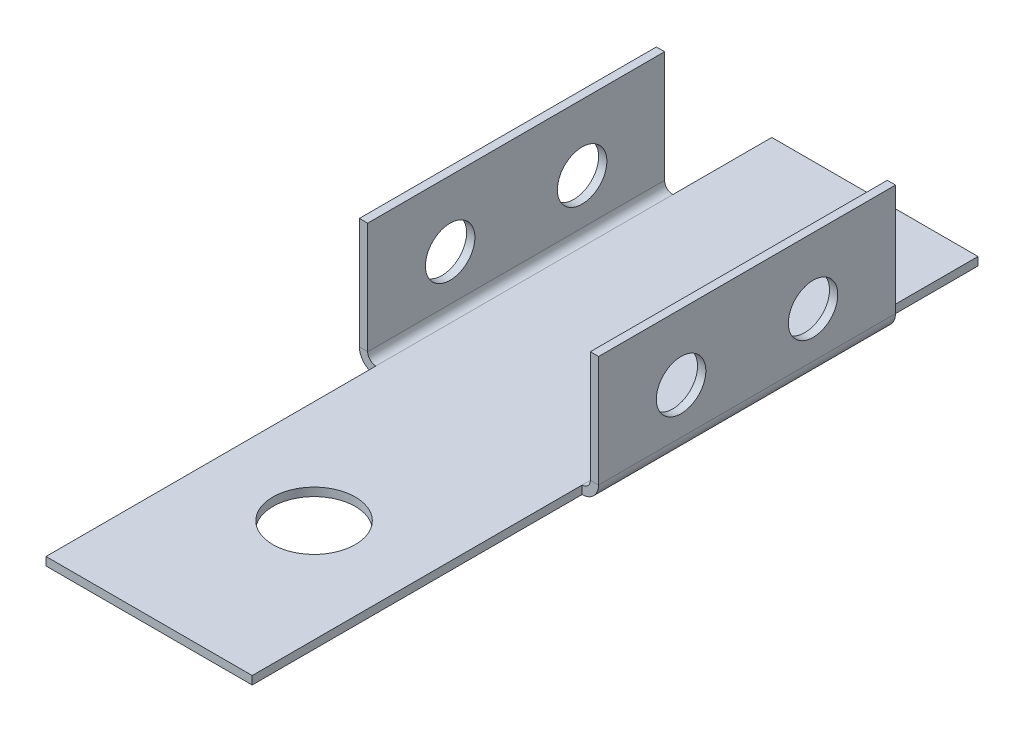
ISO-10303-21;
HEADER;
FILE_DESCRIPTION(('STEP AP214'),'2;1');
FILE_NAME('part.step','',(''),(''),'','','');
FILE_SCHEMA(('AUTOMOTIVE_DESIGN { 1 0 10303 214 1 1 1 1 }'));
ENDSEC;
DATA;
#1=APPLICATION_CONTEXT('core data for automotive mechanical design processes');
#2=APPLICATION_PROTOCOL_DEFINITION('international standard','automotive_design',2000,#1);
#3=PRODUCT_CONTEXT('',#1,'mechanical');
#4=PRODUCT('Part','Part','',(#3));
#5=PRODUCT_RELATED_PRODUCT_CATEGORY('part','',(#4));
#6=PRODUCT_DEFINITION_FORMATION('','',#4);
#7=PRODUCT_DEFINITION_CONTEXT('part definition',#1,'design');
#8=PRODUCT_DEFINITION('design','',#6,#7);
#9=PRODUCT_DEFINITION_SHAPE('','',#8);
#10=(LENGTH_UNIT() NAMED_UNIT(*) SI_UNIT(.MILLI.,.METRE.));
#11=(NAMED_UNIT(*) PLANE_ANGLE_UNIT() SI_UNIT($,.RADIAN.));
#12=(NAMED_UNIT(*) SI_UNIT($,.STERADIAN.) SOLID_ANGLE_UNIT());
#13=UNCERTAINTY_MEASURE_WITH_UNIT(LENGTH_MEASURE(1.E-05),#10,'distance_accuracy_value','');
#14=(GEOMETRIC_REPRESENTATION_CONTEXT(3) GLOBAL_UNCERTAINTY_ASSIGNED_CONTEXT((#13)) GLOBAL_UNIT_ASSIGNED_CONTEXT((#10,
#11,#12)) REPRESENTATION_CONTEXT('',''));
#15=CARTESIAN_POINT('',(0.,0.,0.));
#16=DIRECTION('',(0.,0.,1.));
#17=DIRECTION('',(1.,0.,0.));
#18=AXIS2_PLACEMENT_3D('',#15,#16,#17);
#19=CARTESIAN_POINT('',(-24.0068697123519,-13.5559898477157,48.));
#20=DIRECTION('',(-1.,0.,0.));
#21=DIRECTION('',(0.,0.,1.));
#22=AXIS2_PLACEMENT_3D('',#19,#20,#21);
#23=PLANE('',#22);
#24=CARTESIAN_POINT('',(-24.0068697123519,-9.80598984771573,23.));
#25=DIRECTION('',(-1.,0.,0.));
#26=DIRECTION('',(0.,0.,1.));
#27=AXIS2_PLACEMENT_3D('',#24,#25,#26);
#28=CIRCLE('',#27,1.5);
#29=CARTESIAN_POINT('',(-24.0068697123519,-9.80598984771573,24.5));
#30=VERTEX_POINT('',#29);
#31=EDGE_CURVE('E239',#30,#30,#28,.T.);
#32=ORIENTED_EDGE('',*,*,#31,.T.);
#33=EDGE_LOOP('',(#32));
#34=FACE_BOUND('',#33,.T.);
#35=CARTESIAN_POINT('',(-24.0068697123519,-9.80598984771573,15.));
#36=DIRECTION('',(-1.,0.,0.));
#37=DIRECTION('',(0.,0.,1.));
#38=AXIS2_PLACEMENT_3D('',#35,#36,#37);
#39=CIRCLE('',#38,1.5);
#40=CARTESIAN_POINT('',(-24.0068697123519,-9.80598984771573,16.5));
#41=VERTEX_POINT('',#40);
#42=EDGE_CURVE('E233',#41,#41,#39,.T.);
#43=ORIENTED_EDGE('',*,*,#42,.T.);
#44=EDGE_LOOP('',(#43));
#45=FACE_BOUND('',#44,.T.);
#46=DIRECTION('',(0.,1.,0.));
#47=VECTOR('',#46,1.);
#48=CARTESIAN_POINT('',(-24.0068697123519,-13.5559898477157,28.));
#49=LINE('',#48,#47);
#50=CARTESIAN_POINT('',(-24.0068697123519,-5.80598984771573,28.));
#51=VERTEX_POINT('',#50);
#52=CARTESIAN_POINT('',(-24.0068697123519,-12.5559898477157,28.));
#53=VERTEX_POINT('',#52);
#54=EDGE_CURVE('E443',#51,#53,#49,.F.);
#55=ORIENTED_EDGE('',*,*,#54,.T.);
#56=DIRECTION('',(0.,0.,-1.));
#57=VECTOR('',#56,1.);
#58=CARTESIAN_POINT('',(-24.0068697123519,-12.5559898477157,48.));
#59=LINE('',#58,#57);
#60=CARTESIAN_POINT('',(-24.0068697123519,-12.5559898477157,10.));
#61=VERTEX_POINT('',#60);
#62=EDGE_CURVE('E68',#53,#61,#59,.T.);
#63=ORIENTED_EDGE('',*,*,#62,.T.);
#64=DIRECTION('',(0.,1.,0.));
#65=VECTOR('',#64,1.);
#66=CARTESIAN_POINT('',(-24.0068697123519,-13.5559898477157,10.));
#67=LINE('',#66,#65);
#68=CARTESIAN_POINT('',(-24.0068697123519,-5.80598984771573,10.));
#69=VERTEX_POINT('',#68);
#70=EDGE_CURVE('E388',#61,#69,#67,.T.);
#71=ORIENTED_EDGE('',*,*,#70,.T.);
#72=DIRECTION('',(0.,0.,-1.));
#73=VECTOR('',#72,1.);
#74=CARTESIAN_POINT('',(-24.0068697123519,-5.80598984771573,48.));
#75=LINE('',#74,#73);
#76=EDGE_CURVE('E285',#51,#69,#75,.T.);
#77=ORIENTED_EDGE('',*,*,#76,.F.);
#78=EDGE_LOOP('',(#55,#63,#71,#77));
#79=FACE_BOUND('',#78,.T.);
#80=ADVANCED_FACE('F46',(#34,#45,#79),#23,.F.);
#81=CARTESIAN_POINT('',(-24.5068697123519,-13.5559898477157,48.));
#82=DIRECTION('',(-1.,0.,0.));
#83=DIRECTION('',(0.,0.,1.));
#84=AXIS2_PLACEMENT_3D('',#81,#82,#83);
#85=PLANE('',#84);
#86=CARTESIAN_POINT('',(-24.5068697123519,-9.80598984771573,23.));
#87=DIRECTION('',(-1.,0.,0.));
#88=DIRECTION('',(0.,0.,1.));
#89=AXIS2_PLACEMENT_3D('',#86,#87,#88);
#90=CIRCLE('',#89,1.5);
#91=CARTESIAN_POINT('',(-24.5068697123519,-9.80598984771573,24.5));
#92=VERTEX_POINT('',#91);
#93=EDGE_CURVE('E236',#92,#92,#90,.T.);
#94=ORIENTED_EDGE('',*,*,#93,.F.);
#95=EDGE_LOOP('',(#94));
#96=FACE_BOUND('',#95,.T.);
#97=CARTESIAN_POINT('',(-24.5068697123519,-9.80598984771573,15.));
#98=DIRECTION('',(-1.,0.,0.));
#99=DIRECTION('',(0.,0.,1.));
#100=AXIS2_PLACEMENT_3D('',#97,#98,#99);
#101=CIRCLE('',#100,1.5);
#102=CARTESIAN_POINT('',(-24.5068697123519,-9.80598984771573,16.5));
#103=VERTEX_POINT('',#102);
#104=EDGE_CURVE('E230',#103,#103,#101,.T.);
#105=ORIENTED_EDGE('',*,*,#104,.F.);
#106=EDGE_LOOP('',(#105));
#107=FACE_BOUND('',#106,.T.);
#108=DIRECTION('',(0.,0.,-1.));
#109=VECTOR('',#108,1.);
#110=CARTESIAN_POINT('',(-24.5068697123519,-12.5559898477157,48.));
#111=LINE('',#110,#109);
#112=CARTESIAN_POINT('',(-24.5068697123519,-12.5559898477157,28.));
#113=VERTEX_POINT('',#112);
#114=CARTESIAN_POINT('',(-24.5068697123519,-12.5559898477157,10.));
#115=VERTEX_POINT('',#114);
#116=EDGE_CURVE('E281',#113,#115,#111,.T.);
#117=ORIENTED_EDGE('',*,*,#116,.F.);
#118=DIRECTION('',(0.,-1.,0.));
#119=VECTOR('',#118,1.);
#120=CARTESIAN_POINT('',(-24.5068697123519,-13.5559898477157,28.));
#121=LINE('',#120,#119);
#122=CARTESIAN_POINT('',(-24.5068697123519,-5.80598984771573,28.));
#123=VERTEX_POINT('',#122);
#124=EDGE_CURVE('E435',#123,#113,#121,.T.);
#125=ORIENTED_EDGE('',*,*,#124,.F.);
#126=DIRECTION('',(0.,0.,-1.));
#127=VECTOR('',#126,1.);
#128=CARTESIAN_POINT('',(-24.5068697123519,-5.80598984771573,48.));
#129=LINE('',#128,#127);
#130=CARTESIAN_POINT('',(-24.5068697123519,-5.80598984771573,10.));
#131=VERTEX_POINT('',#130);
#132=EDGE_CURVE('E283',#123,#131,#129,.T.);
#133=ORIENTED_EDGE('',*,*,#132,.T.);
#134=DIRECTION('',(0.,1.,0.));
#135=VECTOR('',#134,1.);
#136=CARTESIAN_POINT('',(-24.5068697123519,-13.5559898477157,10.));
#137=LINE('',#136,#135);
#138=EDGE_CURVE('E387',#115,#131,#137,.T.);
#139=ORIENTED_EDGE('',*,*,#138,.F.);
#140=EDGE_LOOP('',(#117,#125,#133,#139));
#141=FACE_BOUND('',#140,.T.);
#142=ADVANCED_FACE('F312',(#96,#107,#141),#85,.T.);
#143=CARTESIAN_POINT('',(-24.5068697123519,-5.80598984771573,48.));
#144=DIRECTION('',(0.,1.,0.));
#145=DIRECTION('',(0.,0.,1.));
#146=AXIS2_PLACEMENT_3D('',#143,#144,#145);
#147=PLANE('',#146);
#148=ORIENTED_EDGE('',*,*,#132,.F.);
#149=DIRECTION('',(-1.,0.,0.));
#150=VECTOR('',#149,1.);
#151=CARTESIAN_POINT('',(-24.5068697123519,-5.80598984771573,28.));
#152=LINE('',#151,#150);
#153=EDGE_CURVE('E381',#123,#51,#152,.F.);
#154=ORIENTED_EDGE('',*,*,#153,.T.);
#155=ORIENTED_EDGE('',*,*,#76,.T.);
#156=DIRECTION('',(-1.,0.,0.));
#157=VECTOR('',#156,1.);
#158=CARTESIAN_POINT('',(-24.5068697123519,-5.80598984771573,10.));
#159=LINE('',#158,#157);
#160=EDGE_CURVE('E187',#131,#69,#159,.F.);
#161=ORIENTED_EDGE('',*,*,#160,.F.);
#162=EDGE_LOOP('',(#148,#154,#155,#161));
#163=FACE_BOUND('',#162,.T.);
#164=ADVANCED_FACE('F317',(#163),#147,.T.);
#165=CARTESIAN_POINT('',(-25.0068697123519,-12.5559898477157,48.));
#166=DIRECTION('',(0.,0.,-1.));
#167=DIRECTION('',(-1.,0.,0.));
#168=AXIS2_PLACEMENT_3D('',#165,#166,#167);
#169=CYLINDRICAL_SURFACE('',#168,0.5);
#170=DIRECTION('',(0.,0.,-1.));
#171=VECTOR('',#170,1.);
#172=CARTESIAN_POINT('',(-25.0068697123519,-13.0559898477157,48.));
#173=LINE('',#172,#171);
#174=CARTESIAN_POINT('',(-25.0068697123519,-13.0559898477157,28.));
#175=VERTEX_POINT('',#174);
#176=CARTESIAN_POINT('',(-25.0068697123519,-13.0559898477157,10.));
#177=VERTEX_POINT('',#176);
#178=EDGE_CURVE('E277',#175,#177,#173,.T.);
#179=ORIENTED_EDGE('',*,*,#178,.F.);
#180=CARTESIAN_POINT('',(-25.0068697123519,-12.5559898477157,28.));
#181=DIRECTION('',(0.,0.,-1.));
#182=DIRECTION('',(-1.,0.,0.));
#183=AXIS2_PLACEMENT_3D('',#180,#181,#182);
#184=CIRCLE('',#183,0.5);
#185=EDGE_CURVE('E363',#113,#175,#184,.T.);
#186=ORIENTED_EDGE('',*,*,#185,.F.);
#187=ORIENTED_EDGE('',*,*,#116,.T.);
#188=CARTESIAN_POINT('',(-25.0068697123519,-12.5559898477157,10.));
#189=DIRECTION('',(0.,0.,1.));
#190=DIRECTION('',(0.,-1.,0.));
#191=AXIS2_PLACEMENT_3D('',#188,#189,#190);
#192=CIRCLE('',#191,0.5);
#193=EDGE_CURVE('E374',#177,#115,#192,.T.);
#194=ORIENTED_EDGE('',*,*,#193,.F.);
#195=EDGE_LOOP('',(#179,#186,#187,#194));
#196=FACE_BOUND('',#195,.T.);
#197=ADVANCED_FACE('F323',(#196),#169,.F.);
#198=CARTESIAN_POINT('',(-25.0068697123519,-12.5559898477157,48.));
#199=DIRECTION('',(0.,0.,-1.));
#200=DIRECTION('',(-1.,0.,0.));
#201=AXIS2_PLACEMENT_3D('',#198,#199,#200);
#202=CYLINDRICAL_SURFACE('',#201,1.);
#203=CARTESIAN_POINT('',(-25.0068697123519,-12.5559898477157,28.));
#204=DIRECTION('',(0.,0.,-1.));
#205=DIRECTION('',(0.,1.,0.));
#206=AXIS2_PLACEMENT_3D('',#203,#204,#205);
#207=CIRCLE('',#206,1.);
#208=CARTESIAN_POINT('',(-25.0068697123519,-13.5559898477157,28.));
#209=VERTEX_POINT('',#208);
#210=EDGE_CURVE('E356',#53,#209,#207,.T.);
#211=ORIENTED_EDGE('',*,*,#210,.T.);
#212=DIRECTION('',(0.,0.,-1.));
#213=VECTOR('',#212,1.);
#214=CARTESIAN_POINT('',(-25.0068697123519,-13.5559898477157,48.));
#215=LINE('',#214,#213);
#216=CARTESIAN_POINT('',(-25.0068697123519,-13.5559898477157,10.));
#217=VERTEX_POINT('',#216);
#218=EDGE_CURVE('E255',#209,#217,#215,.T.);
#219=ORIENTED_EDGE('',*,*,#218,.T.);
#220=CARTESIAN_POINT('',(-25.0068697123519,-12.5559898477157,10.));
#221=DIRECTION('',(0.,0.,-1.));
#222=DIRECTION('',(-1.,0.,0.));
#223=AXIS2_PLACEMENT_3D('',#220,#221,#222);
#224=CIRCLE('',#223,1.);
#225=EDGE_CURVE('E373',#217,#61,#224,.F.);
#226=ORIENTED_EDGE('',*,*,#225,.T.);
#227=ORIENTED_EDGE('',*,*,#62,.F.);
#228=EDGE_LOOP('',(#211,#219,#226,#227));
#229=FACE_BOUND('',#228,.T.);
#230=ADVANCED_FACE('F328',(#229),#202,.T.);
#231=CARTESIAN_POINT('',(-38.0068697123519,-5.80598984771574,48.));
#232=DIRECTION('',(1.,0.,0.));
#233=DIRECTION('',(0.,1.,0.));
#234=AXIS2_PLACEMENT_3D('',#231,#232,#233);
#235=PLANE('',#234);
#236=CARTESIAN_POINT('',(-38.0068697123519,-9.80598984771573,23.));
#237=DIRECTION('',(1.,0.,0.));
#238=DIRECTION('',(0.,1.,0.));
#239=AXIS2_PLACEMENT_3D('',#236,#237,#238);
#240=CIRCLE('',#239,1.5);
#241=CARTESIAN_POINT('',(-38.0068697123519,-8.30598984771573,23.));
#242=VERTEX_POINT('',#241);
#243=EDGE_CURVE('E224',#242,#242,#240,.T.);
#244=ORIENTED_EDGE('',*,*,#243,.F.);
#245=EDGE_LOOP('',(#244));
#246=FACE_BOUND('',#245,.T.);
#247=CARTESIAN_POINT('',(-38.0068697123519,-9.80598984771573,15.));
#248=DIRECTION('',(1.,0.,0.));
#249=DIRECTION('',(0.,1.,0.));
#250=AXIS2_PLACEMENT_3D('',#247,#248,#249);
#251=CIRCLE('',#250,1.5);
#252=CARTESIAN_POINT('',(-38.0068697123519,-8.30598984771573,15.));
#253=VERTEX_POINT('',#252);
#254=EDGE_CURVE('E218',#253,#253,#251,.T.);
#255=ORIENTED_EDGE('',*,*,#254,.F.);
#256=EDGE_LOOP('',(#255));
#257=FACE_BOUND('',#256,.T.);
#258=DIRECTION('',(0.,0.,-1.));
#259=VECTOR('',#258,1.);
#260=CARTESIAN_POINT('',(-38.0068697123519,-12.5559898477157,48.));
#261=LINE('',#260,#259);
#262=CARTESIAN_POINT('',(-38.0068697123519,-12.5559898477157,28.));
#263=VERTEX_POINT('',#262);
#264=CARTESIAN_POINT('',(-38.0068697123519,-12.5559898477157,10.));
#265=VERTEX_POINT('',#264);
#266=EDGE_CURVE('E271',#263,#265,#261,.T.);
#267=ORIENTED_EDGE('',*,*,#266,.T.);
#268=DIRECTION('',(0.,-1.,0.));
#269=VECTOR('',#268,1.);
#270=CARTESIAN_POINT('',(-38.0068697123519,-5.80598984771575,10.));
#271=LINE('',#270,#269);
#272=CARTESIAN_POINT('',(-38.0068697123519,-5.80598984771573,10.));
#273=VERTEX_POINT('',#272);
#274=EDGE_CURVE('E191',#273,#265,#271,.T.);
#275=ORIENTED_EDGE('',*,*,#274,.F.);
#276=DIRECTION('',(0.,0.,-1.));
#277=VECTOR('',#276,1.);
#278=CARTESIAN_POINT('',(-38.0068697123519,-5.80598984771574,48.));
#279=LINE('',#278,#277);
#280=CARTESIAN_POINT('',(-38.0068697123519,-5.80598984771573,28.));
#281=VERTEX_POINT('',#280);
#282=EDGE_CURVE('E268',#281,#273,#279,.T.);
#283=ORIENTED_EDGE('',*,*,#282,.F.);
#284=DIRECTION('',(0.,1.,0.));
#285=VECTOR('',#284,1.);
#286=CARTESIAN_POINT('',(-38.0068697123519,-5.80598984771574,28.));
#287=LINE('',#286,#285);
#288=EDGE_CURVE('E210',#263,#281,#287,.T.);
#289=ORIENTED_EDGE('',*,*,#288,.F.);
#290=EDGE_LOOP('',(#267,#275,#283,#289));
#291=FACE_BOUND('',#290,.T.);
#292=ADVANCED_FACE('F338',(#246,#257,#291),#235,.T.);
#293=CARTESIAN_POINT('',(-38.5068697123519,-5.80598984771574,48.));
#294=DIRECTION('',(1.,0.,0.));
#295=DIRECTION('',(0.,1.,0.));
#296=AXIS2_PLACEMENT_3D('',#293,#294,#295);
#297=PLANE('',#296);
#298=CARTESIAN_POINT('',(-38.5068697123519,-9.80598984771573,23.));
#299=DIRECTION('',(1.,0.,0.));
#300=DIRECTION('',(0.,1.,0.));
#301=AXIS2_PLACEMENT_3D('',#298,#299,#300);
#302=CIRCLE('',#301,1.5);
#303=CARTESIAN_POINT('',(-38.5068697123519,-8.30598984771573,23.));
#304=VERTEX_POINT('',#303);
#305=EDGE_CURVE('E227',#304,#304,#302,.T.);
#306=ORIENTED_EDGE('',*,*,#305,.T.);
#307=EDGE_LOOP('',(#306));
#308=FACE_BOUND('',#307,.T.);
#309=CARTESIAN_POINT('',(-38.5068697123519,-9.80598984771573,15.));
#310=DIRECTION('',(1.,0.,0.));
#311=DIRECTION('',(0.,1.,0.));
#312=AXIS2_PLACEMENT_3D('',#309,#310,#311);
#313=CIRCLE('',#312,1.5);
#314=CARTESIAN_POINT('',(-38.5068697123519,-8.30598984771573,15.));
#315=VERTEX_POINT('',#314);
#316=EDGE_CURVE('E221',#315,#315,#313,.T.);
#317=ORIENTED_EDGE('',*,*,#316,.T.);
#318=EDGE_LOOP('',(#317));
#319=FACE_BOUND('',#318,.T.);
#320=DIRECTION('',(0.,1.,0.));
#321=VECTOR('',#320,1.);
#322=CARTESIAN_POINT('',(-38.5068697123519,-5.80598984771574,10.));
#323=LINE('',#322,#321);
#324=CARTESIAN_POINT('',(-38.5068697123519,-5.80598984771573,10.));
#325=VERTEX_POINT('',#324);
#326=CARTESIAN_POINT('',(-38.5068697123519,-12.5559898477157,10.));
#327=VERTEX_POINT('',#326);
#328=EDGE_CURVE('E192',#325,#327,#323,.F.);
#329=ORIENTED_EDGE('',*,*,#328,.T.);
#330=DIRECTION('',(0.,0.,-1.));
#331=VECTOR('',#330,1.);
#332=CARTESIAN_POINT('',(-38.5068697123519,-12.5559898477157,48.));
#333=LINE('',#332,#331);
#334=CARTESIAN_POINT('',(-38.5068697123519,-12.5559898477157,28.));
#335=VERTEX_POINT('',#334);
#336=EDGE_CURVE('E262',#335,#327,#333,.T.);
#337=ORIENTED_EDGE('',*,*,#336,.F.);
#338=DIRECTION('',(0.,1.,0.));
#339=VECTOR('',#338,1.);
#340=CARTESIAN_POINT('',(-38.5068697123519,-5.80598984771573,28.));
#341=LINE('',#340,#339);
#342=CARTESIAN_POINT('',(-38.5068697123519,-5.80598984771573,28.));
#343=VERTEX_POINT('',#342);
#344=EDGE_CURVE('E209',#335,#343,#341,.T.);
#345=ORIENTED_EDGE('',*,*,#344,.T.);
#346=DIRECTION('',(0.,0.,-1.));
#347=VECTOR('',#346,1.);
#348=CARTESIAN_POINT('',(-38.5068697123519,-5.80598984771574,48.));
#349=LINE('',#348,#347);
#350=EDGE_CURVE('E265',#343,#325,#349,.T.);
#351=ORIENTED_EDGE('',*,*,#350,.T.);
#352=EDGE_LOOP('',(#329,#337,#345,#351));
#353=FACE_BOUND('',#352,.T.);
#354=ADVANCED_FACE('F336',(#308,#319,#353),#297,.F.);
#355=CARTESIAN_POINT('',(-37.5068697123519,-12.5559898477157,48.));
#356=DIRECTION('',(0.,0.,-1.));
#357=DIRECTION('',(-1.,0.,0.));
#358=AXIS2_PLACEMENT_3D('',#355,#356,#357);
#359=CYLINDRICAL_SURFACE('',#358,0.5);
#360=DIRECTION('',(0.,0.,-1.));
#361=VECTOR('',#360,1.);
#362=CARTESIAN_POINT('',(-37.5068697123519,-13.0559898477157,48.));
#363=LINE('',#362,#361);
#364=CARTESIAN_POINT('',(-37.5068697123519,-13.0559898477157,28.));
#365=VERTEX_POINT('',#364);
#366=CARTESIAN_POINT('',(-37.5068697123519,-13.0559898477157,10.));
#367=VERTEX_POINT('',#366);
#368=EDGE_CURVE('E274',#365,#367,#363,.T.);
#369=ORIENTED_EDGE('',*,*,#368,.T.);
#370=CARTESIAN_POINT('',(-37.5068697123519,-12.5559898477157,10.));
#371=DIRECTION('',(0.,0.,1.));
#372=DIRECTION('',(0.,-1.,0.));
#373=AXIS2_PLACEMENT_3D('',#370,#371,#372);
#374=CIRCLE('',#373,0.5);
#375=EDGE_CURVE('E182',#265,#367,#374,.T.);
#376=ORIENTED_EDGE('',*,*,#375,.F.);
#377=ORIENTED_EDGE('',*,*,#266,.F.);
#378=CARTESIAN_POINT('',(-37.5068697123519,-12.5559898477157,28.));
#379=DIRECTION('',(0.,0.,-1.));
#380=DIRECTION('',(0.,1.,0.));
#381=AXIS2_PLACEMENT_3D('',#378,#379,#380);
#382=CIRCLE('',#381,0.5);
#383=EDGE_CURVE('E200',#365,#263,#382,.T.);
#384=ORIENTED_EDGE('',*,*,#383,.F.);
#385=EDGE_LOOP('',(#369,#376,#377,#384));
#386=FACE_BOUND('',#385,.T.);
#387=ADVANCED_FACE('F332',(#386),#359,.F.);
#388=CARTESIAN_POINT('',(-38.5068697123519,-5.80598984771574,48.));
#389=DIRECTION('',(0.,1.,0.));
#390=DIRECTION('',(-1.,0.,0.));
#391=AXIS2_PLACEMENT_3D('',#388,#389,#390);
#392=PLANE('',#391);
#393=ORIENTED_EDGE('',*,*,#282,.T.);
#394=DIRECTION('',(1.,0.,0.));
#395=VECTOR('',#394,1.);
#396=CARTESIAN_POINT('',(-38.0068697123519,-5.80598984771573,10.));
#397=LINE('',#396,#395);
#398=EDGE_CURVE('E195',#273,#325,#397,.F.);
#399=ORIENTED_EDGE('',*,*,#398,.T.);
#400=ORIENTED_EDGE('',*,*,#350,.F.);
#401=DIRECTION('',(-1.,0.,0.));
#402=VECTOR('',#401,1.);
#403=CARTESIAN_POINT('',(-38.5068697123519,-5.80598984771573,28.));
#404=LINE('',#403,#402);
#405=EDGE_CURVE('E215',#343,#281,#404,.F.);
#406=ORIENTED_EDGE('',*,*,#405,.T.);
#407=EDGE_LOOP('',(#393,#399,#400,#406));
#408=FACE_BOUND('',#407,.T.);
#409=ADVANCED_FACE('F335',(#408),#392,.T.);
#410=CARTESIAN_POINT('',(-37.5068697123519,-12.5559898477157,48.));
#411=DIRECTION('',(0.,0.,-1.));
#412=DIRECTION('',(-1.,0.,0.));
#413=AXIS2_PLACEMENT_3D('',#410,#411,#412);
#414=CYLINDRICAL_SURFACE('',#413,1.);
#415=CARTESIAN_POINT('',(-37.5068697123519,-12.5559898477157,10.));
#416=DIRECTION('',(0.,0.,-1.));
#417=DIRECTION('',(-1.,0.,0.));
#418=AXIS2_PLACEMENT_3D('',#415,#416,#417);
#419=CIRCLE('',#418,1.);
#420=CARTESIAN_POINT('',(-37.5068697123519,-13.5559898477157,10.));
#421=VERTEX_POINT('',#420);
#422=EDGE_CURVE('E181',#327,#421,#419,.F.);
#423=ORIENTED_EDGE('',*,*,#422,.T.);
#424=DIRECTION('',(0.,0.,-1.));
#425=VECTOR('',#424,1.);
#426=CARTESIAN_POINT('',(-37.5068697123519,-13.5559898477157,48.));
#427=LINE('',#426,#425);
#428=CARTESIAN_POINT('',(-37.5068697123519,-13.5559898477157,28.));
#429=VERTEX_POINT('',#428);
#430=EDGE_CURVE('E258',#429,#421,#427,.T.);
#431=ORIENTED_EDGE('',*,*,#430,.F.);
#432=CARTESIAN_POINT('',(-37.5068697123519,-12.5559898477157,28.));
#433=DIRECTION('',(0.,0.,-1.));
#434=DIRECTION('',(-1.,0.,0.));
#435=AXIS2_PLACEMENT_3D('',#432,#433,#434);
#436=CIRCLE('',#435,1.);
#437=EDGE_CURVE('E203',#429,#335,#436,.T.);
#438=ORIENTED_EDGE('',*,*,#437,.T.);
#439=ORIENTED_EDGE('',*,*,#336,.T.);
#440=EDGE_LOOP('',(#423,#431,#438,#439));
#441=FACE_BOUND('',#440,.T.);
#442=ADVANCED_FACE('F344',(#441),#414,.T.);
#443=CARTESIAN_POINT('',(-24.5068697123519,-12.5559898477157,48.));
#444=DIRECTION('',(0.,0.,1.));
#445=DIRECTION('',(1.,0.,0.));
#446=AXIS2_PLACEMENT_3D('',#443,#444,#445);
#447=PLANE('',#446);
#448=DIRECTION('',(1.,0.,0.));
#449=VECTOR('',#448,1.);
#450=CARTESIAN_POINT('',(-38.5068697123519,-13.5559898477157,48.));
#451=LINE('',#450,#449);
#452=CARTESIAN_POINT('',(-37.5068697123519,-13.5559898477157,48.));
#453=VERTEX_POINT('',#452);
#454=CARTESIAN_POINT('',(-25.0068697123519,-13.5559898477157,48.));
#455=VERTEX_POINT('',#454);
#456=EDGE_CURVE('E251',#453,#455,#451,.T.);
#457=ORIENTED_EDGE('',*,*,#456,.T.);
#458=DIRECTION('',(0.,1.,0.));
#459=VECTOR('',#458,1.);
#460=CARTESIAN_POINT('',(-25.0068697123519,-13.5559898477157,48.));
#461=LINE('',#460,#459);
#462=CARTESIAN_POINT('',(-25.0068697123519,-13.0559898477157,48.));
#463=VERTEX_POINT('',#462);
#464=EDGE_CURVE('E287',#455,#463,#461,.T.);
#465=ORIENTED_EDGE('',*,*,#464,.T.);
#466=DIRECTION('',(1.,0.,0.));
#467=VECTOR('',#466,1.);
#468=CARTESIAN_POINT('',(-38.5068697123519,-13.0559898477157,48.));
#469=LINE('',#468,#467);
#470=CARTESIAN_POINT('',(-37.5068697123519,-13.0559898477157,48.));
#471=VERTEX_POINT('',#470);
#472=EDGE_CURVE('E248',#471,#463,#469,.T.);
#473=ORIENTED_EDGE('',*,*,#472,.F.);
#474=DIRECTION('',(0.,-1.,0.));
#475=VECTOR('',#474,1.);
#476=CARTESIAN_POINT('',(-37.5068697123519,-13.0559898477157,48.));
#477=LINE('',#476,#475);
#478=EDGE_CURVE('E54',#471,#453,#477,.T.);
#479=ORIENTED_EDGE('',*,*,#478,.T.);
#480=EDGE_LOOP('',(#457,#465,#473,#479));
#481=FACE_BOUND('',#480,.T.);
#482=ADVANCED_FACE('F48',(#481),#447,.T.);
#483=CARTESIAN_POINT('',(-38.5068697123519,-13.0559898477157,48.));
#484=DIRECTION('',(0.,1.,0.));
#485=DIRECTION('',(-1.,0.,0.));
#486=AXIS2_PLACEMENT_3D('',#483,#484,#485);
#487=PLANE('',#486);
#488=DIRECTION('',(1.,0.,0.));
#489=VECTOR('',#488,1.);
#490=CARTESIAN_POINT('',(-37.5068697123519,-13.0559898477157,4.));
#491=LINE('',#490,#489);
#492=CARTESIAN_POINT('',(-37.5068697123519,-13.0559898477157,4.));
#493=VERTEX_POINT('',#492);
#494=CARTESIAN_POINT('',(-25.0068697123519,-13.0559898477157,4.));
#495=VERTEX_POINT('',#494);
#496=EDGE_CURVE('E60',#493,#495,#491,.T.);
#497=ORIENTED_EDGE('',*,*,#496,.F.);
#498=DIRECTION('',(0.,0.,-1.));
#499=VECTOR('',#498,1.);
#500=CARTESIAN_POINT('',(-37.5068697123519,-13.0559898477157,48.));
#501=LINE('',#500,#499);
#502=EDGE_CURVE('E172',#367,#493,#501,.T.);
#503=ORIENTED_EDGE('',*,*,#502,.F.);
#504=ORIENTED_EDGE('',*,*,#368,.F.);
#505=EDGE_CURVE('E275',#471,#365,#363,.T.);
#506=ORIENTED_EDGE('',*,*,#505,.F.);
#507=ORIENTED_EDGE('',*,*,#472,.T.);
#508=EDGE_CURVE('E278',#463,#175,#173,.T.);
#509=ORIENTED_EDGE('',*,*,#508,.T.);
#510=ORIENTED_EDGE('',*,*,#178,.T.);
#511=DIRECTION('',(0.,0.,-1.));
#512=VECTOR('',#511,1.);
#513=CARTESIAN_POINT('',(-25.0068697123519,-13.0559898477157,48.));
#514=LINE('',#513,#512);
#515=EDGE_CURVE('E175',#177,#495,#514,.T.);
#516=ORIENTED_EDGE('',*,*,#515,.T.);
#517=EDGE_LOOP('',(#497,#503,#504,#506,#507,#509,#510,#516));
#518=FACE_BOUND('',#517,.T.);
#519=CARTESIAN_POINT('',(-31.2568697123519,-13.0559898477157,38.));
#520=DIRECTION('',(0.,1.,0.));
#521=DIRECTION('',(-1.,0.,0.));
#522=AXIS2_PLACEMENT_3D('',#519,#520,#521);
#523=CIRCLE('',#522,2.5);
#524=CARTESIAN_POINT('',(-33.7568697123519,-13.0559898477157,38.));
#525=VERTEX_POINT('',#524);
#526=EDGE_CURVE('E242',#525,#525,#523,.T.);
#527=ORIENTED_EDGE('',*,*,#526,.F.);
#528=EDGE_LOOP('',(#527));
#529=FACE_BOUND('',#528,.T.);
#530=ADVANCED_FACE('F169',(#518,#529),#487,.T.);
#531=CARTESIAN_POINT('',(-38.5068697123519,-13.5559898477157,48.));
#532=DIRECTION('',(0.,1.,0.));
#533=DIRECTION('',(-1.,0.,0.));
#534=AXIS2_PLACEMENT_3D('',#531,#532,#533);
#535=PLANE('',#534);
#536=CARTESIAN_POINT('',(-31.2568697123519,-13.5559898477157,38.));
#537=DIRECTION('',(0.,1.,0.));
#538=DIRECTION('',(-1.,0.,0.));
#539=AXIS2_PLACEMENT_3D('',#536,#537,#538);
#540=CIRCLE('',#539,2.5);
#541=CARTESIAN_POINT('',(-33.7568697123519,-13.5559898477157,38.));
#542=VERTEX_POINT('',#541);
#543=EDGE_CURVE('E247',#542,#542,#540,.T.);
#544=ORIENTED_EDGE('',*,*,#543,.T.);
#545=EDGE_LOOP('',(#544));
#546=FACE_BOUND('',#545,.T.);
#547=DIRECTION('',(0.,0.,-1.));
#548=VECTOR('',#547,1.);
#549=CARTESIAN_POINT('',(-37.5068697123519,-13.5559898477157,48.));
#550=LINE('',#549,#548);
#551=CARTESIAN_POINT('',(-37.5068697123519,-13.5559898477157,4.));
#552=VERTEX_POINT('',#551);
#553=EDGE_CURVE('E185',#421,#552,#550,.T.);
#554=ORIENTED_EDGE('',*,*,#553,.T.);
#555=DIRECTION('',(1.,0.,0.));
#556=VECTOR('',#555,1.);
#557=CARTESIAN_POINT('',(-38.5068697123519,-13.5559898477157,4.));
#558=LINE('',#557,#556);
#559=CARTESIAN_POINT('',(-25.0068697123519,-13.5559898477157,4.));
#560=VERTEX_POINT('',#559);
#561=EDGE_CURVE('E161',#552,#560,#558,.T.);
#562=ORIENTED_EDGE('',*,*,#561,.T.);
#563=DIRECTION('',(0.,0.,-1.));
#564=VECTOR('',#563,1.);
#565=CARTESIAN_POINT('',(-25.0068697123519,-13.5559898477157,48.));
#566=LINE('',#565,#564);
#567=EDGE_CURVE('E370',#217,#560,#566,.T.);
#568=ORIENTED_EDGE('',*,*,#567,.F.);
#569=ORIENTED_EDGE('',*,*,#218,.F.);
#570=EDGE_CURVE('E256',#455,#209,#215,.T.);
#571=ORIENTED_EDGE('',*,*,#570,.F.);
#572=ORIENTED_EDGE('',*,*,#456,.F.);
#573=EDGE_CURVE('E259',#453,#429,#427,.T.);
#574=ORIENTED_EDGE('',*,*,#573,.T.);
#575=ORIENTED_EDGE('',*,*,#430,.T.);
#576=EDGE_LOOP('',(#554,#562,#568,#569,#571,#572,#574,#575));
#577=FACE_BOUND('',#576,.T.);
#578=ADVANCED_FACE('F294',(#546,#577),#535,.F.);
#579=CARTESIAN_POINT('',(-31.2568697123519,-23.0559898477157,38.));
#580=DIRECTION('',(0.,1.,0.));
#581=DIRECTION('',(-1.,0.,0.));
#582=AXIS2_PLACEMENT_3D('',#579,#580,#581);
#583=CYLINDRICAL_SURFACE('',#582,2.5);
#584=ORIENTED_EDGE('',*,*,#526,.T.);
#585=EDGE_LOOP('',(#584));
#586=FACE_BOUND('',#585,.T.);
#587=ORIENTED_EDGE('',*,*,#543,.F.);
#588=EDGE_LOOP('',(#587));
#589=FACE_BOUND('',#588,.T.);
#590=ADVANCED_FACE('F297',(#586,#589),#583,.F.);
#591=CARTESIAN_POINT('',(-24.5068697123519,-9.80598984771573,23.));
#592=DIRECTION('',(-1.,0.,0.));
#593=DIRECTION('',(0.,0.,1.));
#594=AXIS2_PLACEMENT_3D('',#591,#592,#593);
#595=CYLINDRICAL_SURFACE('',#594,1.5);
#596=ORIENTED_EDGE('',*,*,#31,.F.);
#597=EDGE_LOOP('',(#596));
#598=FACE_BOUND('',#597,.T.);
#599=ORIENTED_EDGE('',*,*,#93,.T.);
#600=EDGE_LOOP('',(#599));
#601=FACE_BOUND('',#600,.T.);
#602=ADVANCED_FACE('F299',(#598,#601),#595,.F.);
#603=CARTESIAN_POINT('',(-24.5068697123519,-9.80598984771573,15.));
#604=DIRECTION('',(-1.,0.,0.));
#605=DIRECTION('',(0.,0.,1.));
#606=AXIS2_PLACEMENT_3D('',#603,#604,#605);
#607=CYLINDRICAL_SURFACE('',#606,1.5);
#608=ORIENTED_EDGE('',*,*,#42,.F.);
#609=EDGE_LOOP('',(#608));
#610=FACE_BOUND('',#609,.T.);
#611=ORIENTED_EDGE('',*,*,#104,.T.);
#612=EDGE_LOOP('',(#611));
#613=FACE_BOUND('',#612,.T.);
#614=ADVANCED_FACE('F306',(#610,#613),#607,.F.);
#615=CARTESIAN_POINT('',(-38.0068697123519,-9.80598984771573,23.));
#616=DIRECTION('',(1.,0.,0.));
#617=DIRECTION('',(0.,1.,0.));
#618=AXIS2_PLACEMENT_3D('',#615,#616,#617);
#619=CYLINDRICAL_SURFACE('',#618,1.5);
#620=ORIENTED_EDGE('',*,*,#305,.F.);
#621=EDGE_LOOP('',(#620));
#622=FACE_BOUND('',#621,.T.);
#623=ORIENTED_EDGE('',*,*,#243,.T.);
#624=EDGE_LOOP('',(#623));
#625=FACE_BOUND('',#624,.T.);
#626=ADVANCED_FACE('F488',(#622,#625),#619,.F.);
#627=CARTESIAN_POINT('',(-38.0068697123519,-9.80598984771573,15.));
#628=DIRECTION('',(1.,0.,0.));
#629=DIRECTION('',(0.,1.,0.));
#630=AXIS2_PLACEMENT_3D('',#627,#628,#629);
#631=CYLINDRICAL_SURFACE('',#630,1.5);
#632=ORIENTED_EDGE('',*,*,#316,.F.);
#633=EDGE_LOOP('',(#632));
#634=FACE_BOUND('',#633,.T.);
#635=ORIENTED_EDGE('',*,*,#254,.T.);
#636=EDGE_LOOP('',(#635));
#637=FACE_BOUND('',#636,.T.);
#638=ADVANCED_FACE('F484',(#634,#637),#631,.F.);
#639=CARTESIAN_POINT('',(-38.5068697123519,-5.80598984771573,28.));
#640=DIRECTION('',(0.,0.,-1.));
#641=DIRECTION('',(0.,1.,0.));
#642=AXIS2_PLACEMENT_3D('',#639,#640,#641);
#643=PLANE('',#642);
#644=ORIENTED_EDGE('',*,*,#405,.F.);
#645=ORIENTED_EDGE('',*,*,#344,.F.);
#646=DIRECTION('',(-1.,0.,0.));
#647=VECTOR('',#646,1.);
#648=CARTESIAN_POINT('',(-38.5068697123519,-12.5559898477157,28.));
#649=LINE('',#648,#647);
#650=EDGE_CURVE('E212',#335,#263,#649,.F.);
#651=ORIENTED_EDGE('',*,*,#650,.T.);
#652=ORIENTED_EDGE('',*,*,#288,.T.);
#653=EDGE_LOOP('',(#644,#645,#651,#652));
#654=FACE_BOUND('',#653,.T.);
#655=ADVANCED_FACE('F478',(#654),#643,.F.);
#656=CARTESIAN_POINT('',(-37.5068697123519,-13.0559898477157,38.));
#657=DIRECTION('',(-1.,0.,0.));
#658=DIRECTION('',(0.,0.,-1.));
#659=AXIS2_PLACEMENT_3D('',#656,#657,#658);
#660=PLANE('',#659);
#661=ORIENTED_EDGE('',*,*,#478,.F.);
#662=ORIENTED_EDGE('',*,*,#505,.T.);
#663=DIRECTION('',(0.,1.,0.));
#664=VECTOR('',#663,1.);
#665=CARTESIAN_POINT('',(-37.5068697123519,-13.0559898477157,28.));
#666=LINE('',#665,#664);
#667=EDGE_CURVE('E206',#365,#429,#666,.F.);
#668=ORIENTED_EDGE('',*,*,#667,.T.);
#669=ORIENTED_EDGE('',*,*,#573,.F.);
#670=EDGE_LOOP('',(#661,#662,#668,#669));
#671=FACE_BOUND('',#670,.T.);
#672=ADVANCED_FACE('F475',(#671),#660,.T.);
#673=CARTESIAN_POINT('',(-37.5068697123519,-12.5559898477157,28.));
#674=DIRECTION('',(0.,0.,1.));
#675=DIRECTION('',(0.,-1.,0.));
#676=AXIS2_PLACEMENT_3D('',#673,#674,#675);
#677=PLANE('',#676);
#678=ORIENTED_EDGE('',*,*,#650,.F.);
#679=ORIENTED_EDGE('',*,*,#437,.F.);
#680=ORIENTED_EDGE('',*,*,#667,.F.);
#681=ORIENTED_EDGE('',*,*,#383,.T.);
#682=EDGE_LOOP('',(#678,#679,#680,#681));
#683=FACE_BOUND('',#682,.T.);
#684=ADVANCED_FACE('F474',(#683),#677,.T.);
#685=CARTESIAN_POINT('',(-38.0068697123519,-5.80598984771575,10.));
#686=DIRECTION('',(0.,0.,1.));
#687=DIRECTION('',(0.,-1.,0.));
#688=AXIS2_PLACEMENT_3D('',#685,#686,#687);
#689=PLANE('',#688);
#690=ORIENTED_EDGE('',*,*,#274,.T.);
#691=DIRECTION('',(1.,0.,0.));
#692=VECTOR('',#691,1.);
#693=CARTESIAN_POINT('',(-38.0068697123519,-12.5559898477157,10.));
#694=LINE('',#693,#692);
#695=EDGE_CURVE('E197',#265,#327,#694,.F.);
#696=ORIENTED_EDGE('',*,*,#695,.T.);
#697=ORIENTED_EDGE('',*,*,#328,.F.);
#698=ORIENTED_EDGE('',*,*,#398,.F.);
#699=EDGE_LOOP('',(#690,#696,#697,#698));
#700=FACE_BOUND('',#699,.T.);
#701=ADVANCED_FACE('F407',(#700),#689,.F.);
#702=CARTESIAN_POINT('',(-37.5068697123519,-13.0559898477157,5.));
#703=DIRECTION('',(-1.,0.,0.));
#704=DIRECTION('',(0.,0.,-1.));
#705=AXIS2_PLACEMENT_3D('',#702,#703,#704);
#706=PLANE('',#705);
#707=DIRECTION('',(0.,1.,0.));
#708=VECTOR('',#707,1.);
#709=CARTESIAN_POINT('',(-37.5068697123519,-23.0559898477157,4.));
#710=LINE('',#709,#708);
#711=EDGE_CURVE('E158',#552,#493,#710,.T.);
#712=ORIENTED_EDGE('',*,*,#711,.F.);
#713=ORIENTED_EDGE('',*,*,#553,.F.);
#714=DIRECTION('',(0.,1.,0.));
#715=VECTOR('',#714,1.);
#716=CARTESIAN_POINT('',(-37.5068697123519,-13.0559898477157,10.));
#717=LINE('',#716,#715);
#718=EDGE_CURVE('E180',#367,#421,#717,.F.);
#719=ORIENTED_EDGE('',*,*,#718,.F.);
#720=ORIENTED_EDGE('',*,*,#502,.T.);
#721=EDGE_LOOP('',(#712,#713,#719,#720));
#722=FACE_BOUND('',#721,.T.);
#723=ADVANCED_FACE('F178',(#722),#706,.T.);
#724=CARTESIAN_POINT('',(-37.5068697123519,-12.5559898477157,10.));
#725=DIRECTION('',(0.,0.,-1.));
#726=DIRECTION('',(0.,1.,0.));
#727=AXIS2_PLACEMENT_3D('',#724,#725,#726);
#728=PLANE('',#727);
#729=ORIENTED_EDGE('',*,*,#422,.F.);
#730=ORIENTED_EDGE('',*,*,#695,.F.);
#731=ORIENTED_EDGE('',*,*,#375,.T.);
#732=ORIENTED_EDGE('',*,*,#718,.T.);
#733=EDGE_LOOP('',(#729,#730,#731,#732));
#734=FACE_BOUND('',#733,.T.);
#735=ADVANCED_FACE('F399',(#734),#728,.T.);
#736=CARTESIAN_POINT('',(-24.5068697123519,-13.5559898477157,10.));
#737=DIRECTION('',(0.,0.,1.));
#738=DIRECTION('',(0.,1.,0.));
#739=AXIS2_PLACEMENT_3D('',#736,#737,#738);
#740=PLANE('',#739);
#741=ORIENTED_EDGE('',*,*,#138,.T.);
#742=ORIENTED_EDGE('',*,*,#160,.T.);
#743=ORIENTED_EDGE('',*,*,#70,.F.);
#744=DIRECTION('',(-1.,0.,0.));
#745=VECTOR('',#744,1.);
#746=CARTESIAN_POINT('',(-24.5068697123519,-12.5559898477157,10.));
#747=LINE('',#746,#745);
#748=EDGE_CURVE('E390',#115,#61,#747,.F.);
#749=ORIENTED_EDGE('',*,*,#748,.F.);
#750=EDGE_LOOP('',(#741,#742,#743,#749));
#751=FACE_BOUND('',#750,.T.);
#752=ADVANCED_FACE('F439',(#751),#740,.F.);
#753=CARTESIAN_POINT('',(-25.0068697123519,-13.0559898477157,5.));
#754=DIRECTION('',(-1.,0.,0.));
#755=DIRECTION('',(0.,0.,-1.));
#756=AXIS2_PLACEMENT_3D('',#753,#754,#755);
#757=PLANE('',#756);
#758=DIRECTION('',(0.,1.,0.));
#759=VECTOR('',#758,1.);
#760=CARTESIAN_POINT('',(-25.0068697123519,-13.0559898477157,4.));
#761=LINE('',#760,#759);
#762=EDGE_CURVE('E13',#495,#560,#761,.F.);
#763=ORIENTED_EDGE('',*,*,#762,.F.);
#764=ORIENTED_EDGE('',*,*,#515,.F.);
#765=DIRECTION('',(0.,1.,0.));
#766=VECTOR('',#765,1.);
#767=CARTESIAN_POINT('',(-25.0068697123519,-13.0559898477157,10.));
#768=LINE('',#767,#766);
#769=EDGE_CURVE('E376',#177,#217,#768,.F.);
#770=ORIENTED_EDGE('',*,*,#769,.T.);
#771=ORIENTED_EDGE('',*,*,#567,.T.);
#772=EDGE_LOOP('',(#763,#764,#770,#771));
#773=FACE_BOUND('',#772,.T.);
#774=ADVANCED_FACE('F426',(#773),#757,.F.);
#775=CARTESIAN_POINT('',(-25.0068697123519,-12.5559898477157,10.));
#776=DIRECTION('',(0.,0.,-1.));
#777=DIRECTION('',(0.,1.,0.));
#778=AXIS2_PLACEMENT_3D('',#775,#776,#777);
#779=PLANE('',#778);
#780=ORIENTED_EDGE('',*,*,#748,.T.);
#781=ORIENTED_EDGE('',*,*,#225,.F.);
#782=ORIENTED_EDGE('',*,*,#769,.F.);
#783=ORIENTED_EDGE('',*,*,#193,.T.);
#784=EDGE_LOOP('',(#780,#781,#782,#783));
#785=FACE_BOUND('',#784,.T.);
#786=ADVANCED_FACE('F428',(#785),#779,.T.);
#787=CARTESIAN_POINT('',(-24.5068697123519,-13.5559898477157,28.));
#788=DIRECTION('',(0.,0.,-1.));
#789=DIRECTION('',(0.,-1.,0.));
#790=AXIS2_PLACEMENT_3D('',#787,#788,#789);
#791=PLANE('',#790);
#792=ORIENTED_EDGE('',*,*,#124,.T.);
#793=DIRECTION('',(-1.,0.,0.));
#794=VECTOR('',#793,1.);
#795=CARTESIAN_POINT('',(-24.5068697123519,-12.5559898477157,28.));
#796=LINE('',#795,#794);
#797=EDGE_CURVE('E384',#113,#53,#796,.F.);
#798=ORIENTED_EDGE('',*,*,#797,.T.);
#799=ORIENTED_EDGE('',*,*,#54,.F.);
#800=ORIENTED_EDGE('',*,*,#153,.F.);
#801=EDGE_LOOP('',(#792,#798,#799,#800));
#802=FACE_BOUND('',#801,.T.);
#803=ADVANCED_FACE('F448',(#802),#791,.F.);
#804=CARTESIAN_POINT('',(-25.0068697123519,-12.5559898477157,28.));
#805=DIRECTION('',(0.,0.,1.));
#806=DIRECTION('',(0.,-1.,0.));
#807=AXIS2_PLACEMENT_3D('',#804,#805,#806);
#808=PLANE('',#807);
#809=ORIENTED_EDGE('',*,*,#210,.F.);
#810=ORIENTED_EDGE('',*,*,#797,.F.);
#811=ORIENTED_EDGE('',*,*,#185,.T.);
#812=DIRECTION('',(0.,1.,0.));
#813=VECTOR('',#812,1.);
#814=CARTESIAN_POINT('',(-25.0068697123519,-13.0559898477157,28.));
#815=LINE('',#814,#813);
#816=EDGE_CURVE('E364',#175,#209,#815,.F.);
#817=ORIENTED_EDGE('',*,*,#816,.T.);
#818=EDGE_LOOP('',(#809,#810,#811,#817));
#819=FACE_BOUND('',#818,.T.);
#820=ADVANCED_FACE('F449',(#819),#808,.T.);
#821=CARTESIAN_POINT('',(-25.0068697123519,-13.0559898477157,38.));
#822=DIRECTION('',(-1.,0.,0.));
#823=DIRECTION('',(0.,0.,-1.));
#824=AXIS2_PLACEMENT_3D('',#821,#822,#823);
#825=PLANE('',#824);
#826=ORIENTED_EDGE('',*,*,#816,.F.);
#827=ORIENTED_EDGE('',*,*,#508,.F.);
#828=ORIENTED_EDGE('',*,*,#464,.F.);
#829=ORIENTED_EDGE('',*,*,#570,.T.);
#830=EDGE_LOOP('',(#826,#827,#828,#829));
#831=FACE_BOUND('',#830,.T.);
#832=ADVANCED_FACE('F421',(#831),#825,.F.);
#833=CARTESIAN_POINT('',(-37.5068697123519,-23.0559898477157,4.));
#834=DIRECTION('',(0.,0.,1.));
#835=DIRECTION('',(1.,0.,0.));
#836=AXIS2_PLACEMENT_3D('',#833,#834,#835);
#837=PLANE('',#836);
#838=ORIENTED_EDGE('',*,*,#711,.T.);
#839=ORIENTED_EDGE('',*,*,#496,.T.);
#840=ORIENTED_EDGE('',*,*,#762,.T.);
#841=ORIENTED_EDGE('',*,*,#561,.F.);
#842=EDGE_LOOP('',(#838,#839,#840,#841));
#843=FACE_BOUND('',#842,.T.);
#844=ADVANCED_FACE('F159',(#843),#837,.F.);
#845=CLOSED_SHELL('',(#80,#142,#164,#197,#230,#292,#354,#387,#409,#442,#482,#530,#578,#590,#602,
#614,#626,#638,#655,#672,#684,#701,#723,#735,#752,#774,#786,#803,#820,#832,#844));
#846=MANIFOLD_SOLID_BREP('B2',#845);
#847=ADVANCED_BREP_SHAPE_REPRESENTATION('',(#18,#846),#14);
#848=SHAPE_DEFINITION_REPRESENTATION(#9,#847);
ENDSEC;
END-ISO-10303-21;
